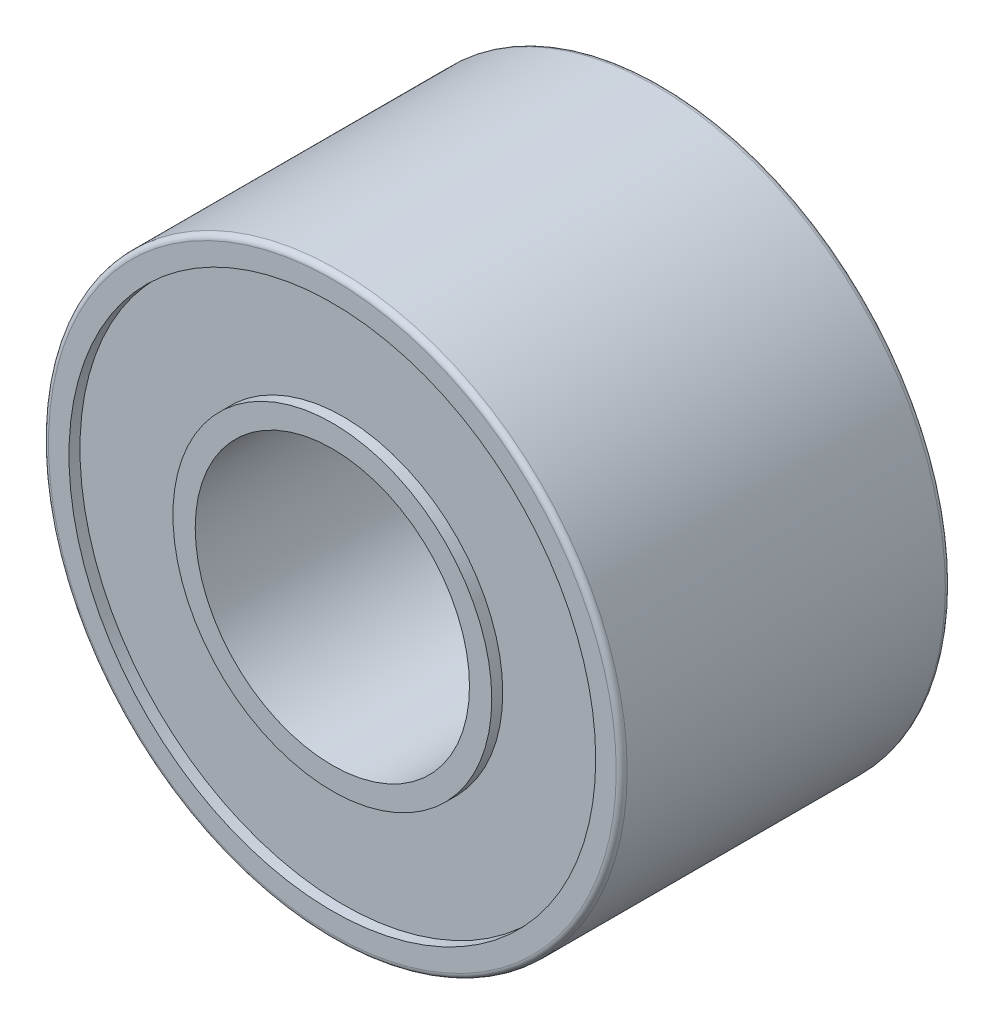
ISO-10303-21;
HEADER;
FILE_DESCRIPTION(('STEP AP214'),'2;1');
FILE_NAME('part.step','',(''),(''),'','','');
FILE_SCHEMA(('AUTOMOTIVE_DESIGN { 1 0 10303 214 1 1 1 1 }'));
ENDSEC;
DATA;
#1=APPLICATION_CONTEXT('core data for automotive mechanical design processes');
#2=APPLICATION_PROTOCOL_DEFINITION('international standard','automotive_design',2000,#1);
#3=PRODUCT_CONTEXT('',#1,'mechanical');
#4=PRODUCT('Part','Part','',(#3));
#5=PRODUCT_RELATED_PRODUCT_CATEGORY('part','',(#4));
#6=PRODUCT_DEFINITION_FORMATION('','',#4);
#7=PRODUCT_DEFINITION_CONTEXT('part definition',#1,'design');
#8=PRODUCT_DEFINITION('design','',#6,#7);
#9=PRODUCT_DEFINITION_SHAPE('','',#8);
#10=(LENGTH_UNIT() NAMED_UNIT(*) SI_UNIT(.MILLI.,.METRE.));
#11=(NAMED_UNIT(*) PLANE_ANGLE_UNIT() SI_UNIT($,.RADIAN.));
#12=(NAMED_UNIT(*) SI_UNIT($,.STERADIAN.) SOLID_ANGLE_UNIT());
#13=UNCERTAINTY_MEASURE_WITH_UNIT(LENGTH_MEASURE(1.E-05),#10,'distance_accuracy_value','');
#14=(GEOMETRIC_REPRESENTATION_CONTEXT(3) GLOBAL_UNCERTAINTY_ASSIGNED_CONTEXT((#13)) GLOBAL_UNIT_ASSIGNED_CONTEXT((#10,
#11,#12)) REPRESENTATION_CONTEXT('',''));
#15=CARTESIAN_POINT('',(0.,0.,0.));
#16=DIRECTION('',(0.,0.,1.));
#17=DIRECTION('',(1.,0.,0.));
#18=AXIS2_PLACEMENT_3D('',#15,#16,#17);
#19=CARTESIAN_POINT('',(0.,0.,-6.));
#20=DIRECTION('',(0.,0.,1.));
#21=DIRECTION('',(1.,0.,0.));
#22=AXIS2_PLACEMENT_3D('',#19,#20,#21);
#23=PLANE('',#22);
#24=CARTESIAN_POINT('',(0.,0.,-6.));
#25=DIRECTION('',(0.,0.,1.));
#26=DIRECTION('',(1.,0.,0.));
#27=AXIS2_PLACEMENT_3D('',#24,#25,#26);
#28=CIRCLE('',#27,5.);
#29=CARTESIAN_POINT('',(5.,0.,-6.));
#30=VERTEX_POINT('',#29);
#31=EDGE_CURVE('E62',#30,#30,#28,.T.);
#32=ORIENTED_EDGE('',*,*,#31,.T.);
#33=EDGE_LOOP('',(#32));
#34=FACE_BOUND('',#33,.T.);
#35=CARTESIAN_POINT('',(0.,0.,-6.));
#36=DIRECTION('',(0.,0.,1.));
#37=DIRECTION('',(1.,0.,0.));
#38=AXIS2_PLACEMENT_3D('',#35,#36,#37);
#39=CIRCLE('',#38,5.81291656527139);
#40=CARTESIAN_POINT('',(5.81291656527139,0.,-6.));
#41=VERTEX_POINT('',#40);
#42=EDGE_CURVE('E94',#41,#41,#39,.T.);
#43=ORIENTED_EDGE('',*,*,#42,.F.);
#44=EDGE_LOOP('',(#43));
#45=FACE_BOUND('',#44,.T.);
#46=ADVANCED_FACE('F37',(#34,#45),#23,.F.);
#47=CARTESIAN_POINT('',(0.,0.,6.));
#48=DIRECTION('',(0.,0.,1.));
#49=DIRECTION('',(1.,0.,0.));
#50=AXIS2_PLACEMENT_3D('',#47,#48,#49);
#51=PLANE('',#50);
#52=CARTESIAN_POINT('',(0.,0.,6.));
#53=DIRECTION('',(0.,0.,1.));
#54=DIRECTION('',(1.,0.,0.));
#55=AXIS2_PLACEMENT_3D('',#52,#53,#54);
#56=CIRCLE('',#55,5.);
#57=CARTESIAN_POINT('',(5.,0.,6.));
#58=VERTEX_POINT('',#57);
#59=EDGE_CURVE('E61',#58,#58,#56,.T.);
#60=ORIENTED_EDGE('',*,*,#59,.F.);
#61=EDGE_LOOP('',(#60));
#62=FACE_BOUND('',#61,.T.);
#63=CARTESIAN_POINT('',(0.,0.,6.));
#64=DIRECTION('',(0.,0.,1.));
#65=DIRECTION('',(1.,0.,0.));
#66=AXIS2_PLACEMENT_3D('',#63,#64,#65);
#67=CIRCLE('',#66,5.81291656527139);
#68=CARTESIAN_POINT('',(5.81291656527139,0.,6.));
#69=VERTEX_POINT('',#68);
#70=EDGE_CURVE('E78',#69,#69,#67,.T.);
#71=ORIENTED_EDGE('',*,*,#70,.T.);
#72=EDGE_LOOP('',(#71));
#73=FACE_BOUND('',#72,.T.);
#74=ADVANCED_FACE('F112',(#62,#73),#51,.T.);
#75=CARTESIAN_POINT('',(0.,0.,6.));
#76=DIRECTION('',(0.,0.,1.));
#77=DIRECTION('',(1.,0.,0.));
#78=AXIS2_PLACEMENT_3D('',#75,#76,#77);
#79=CIRCLE('',#78,9.60229601714226);
#80=CARTESIAN_POINT('',(9.60229601714226,0.,6.));
#81=VERTEX_POINT('',#80);
#82=EDGE_CURVE('E70',#81,#81,#79,.T.);
#83=ORIENTED_EDGE('',*,*,#82,.F.);
#84=EDGE_LOOP('',(#83));
#85=FACE_BOUND('',#84,.T.);
#86=CARTESIAN_POINT('',(0.,0.,6.));
#87=DIRECTION('',(0.,0.,1.));
#88=DIRECTION('',(1.,0.,0.));
#89=AXIS2_PLACEMENT_3D('',#86,#87,#88);
#90=CIRCLE('',#89,10.35);
#91=CARTESIAN_POINT('',(10.35,0.,6.));
#92=VERTEX_POINT('',#91);
#93=EDGE_CURVE('E10',#92,#92,#90,.T.);
#94=ORIENTED_EDGE('',*,*,#93,.T.);
#95=EDGE_LOOP('',(#94));
#96=FACE_BOUND('',#95,.T.);
#97=ADVANCED_FACE('F119',(#85,#96),#51,.T.);
#98=CARTESIAN_POINT('',(0.,0.,-6.));
#99=DIRECTION('',(0.,0.,1.));
#100=DIRECTION('',(1.,0.,0.));
#101=AXIS2_PLACEMENT_3D('',#98,#99,#100);
#102=CIRCLE('',#101,9.60229601714226);
#103=CARTESIAN_POINT('',(9.60229601714226,0.,-6.));
#104=VERTEX_POINT('',#103);
#105=EDGE_CURVE('E86',#104,#104,#102,.T.);
#106=ORIENTED_EDGE('',*,*,#105,.T.);
#107=EDGE_LOOP('',(#106));
#108=FACE_BOUND('',#107,.T.);
#109=CARTESIAN_POINT('',(0.,0.,-6.));
#110=DIRECTION('',(0.,0.,1.));
#111=DIRECTION('',(1.,0.,0.));
#112=AXIS2_PLACEMENT_3D('',#109,#110,#111);
#113=CIRCLE('',#112,10.35);
#114=CARTESIAN_POINT('',(10.35,0.,-6.));
#115=VERTEX_POINT('',#114);
#116=EDGE_CURVE('E45',#115,#115,#113,.F.);
#117=ORIENTED_EDGE('',*,*,#116,.T.);
#118=EDGE_LOOP('',(#117));
#119=FACE_BOUND('',#118,.T.);
#120=ADVANCED_FACE('F115',(#108,#119),#23,.F.);
#121=CARTESIAN_POINT('',(0.,0.,6.));
#122=DIRECTION('',(0.,0.,-1.));
#123=DIRECTION('',(-1.,0.,0.));
#124=AXIS2_PLACEMENT_3D('',#121,#122,#123);
#125=CYLINDRICAL_SURFACE('',#124,10.55);
#126=CARTESIAN_POINT('',(0.,0.,-5.8));
#127=DIRECTION('',(0.,0.,1.));
#128=DIRECTION('',(1.,0.,0.));
#129=AXIS2_PLACEMENT_3D('',#126,#127,#128);
#130=CIRCLE('',#129,10.55);
#131=CARTESIAN_POINT('',(10.55,0.,-5.8));
#132=VERTEX_POINT('',#131);
#133=EDGE_CURVE('E50',#132,#132,#130,.T.);
#134=ORIENTED_EDGE('',*,*,#133,.T.);
#135=EDGE_LOOP('',(#134));
#136=FACE_BOUND('',#135,.T.);
#137=CARTESIAN_POINT('',(0.,0.,5.8));
#138=DIRECTION('',(0.,0.,1.));
#139=DIRECTION('',(1.,0.,0.));
#140=AXIS2_PLACEMENT_3D('',#137,#138,#139);
#141=CIRCLE('',#140,10.55);
#142=CARTESIAN_POINT('',(10.55,0.,5.8));
#143=VERTEX_POINT('',#142);
#144=EDGE_CURVE('E55',#143,#143,#141,.F.);
#145=ORIENTED_EDGE('',*,*,#144,.T.);
#146=EDGE_LOOP('',(#145));
#147=FACE_BOUND('',#146,.T.);
#148=ADVANCED_FACE('F124',(#136,#147),#125,.T.);
#149=CARTESIAN_POINT('',(0.,0.,6.));
#150=DIRECTION('',(0.,0.,-1.));
#151=DIRECTION('',(-1.,0.,0.));
#152=AXIS2_PLACEMENT_3D('',#149,#150,#151);
#153=CYLINDRICAL_SURFACE('',#152,5.);
#154=ORIENTED_EDGE('',*,*,#59,.T.);
#155=EDGE_LOOP('',(#154));
#156=FACE_BOUND('',#155,.T.);
#157=ORIENTED_EDGE('',*,*,#31,.F.);
#158=EDGE_LOOP('',(#157));
#159=FACE_BOUND('',#158,.T.);
#160=ADVANCED_FACE('F130',(#156,#159),#153,.F.);
#161=CARTESIAN_POINT('',(0.,0.,-5.8));
#162=DIRECTION('',(0.,0.,1.));
#163=DIRECTION('',(1.,0.,0.));
#164=AXIS2_PLACEMENT_3D('',#161,#162,#163);
#165=TOROIDAL_SURFACE('',#164,10.35,0.2);
#166=ORIENTED_EDGE('',*,*,#116,.F.);
#167=EDGE_LOOP('',(#166));
#168=FACE_BOUND('',#167,.T.);
#169=ORIENTED_EDGE('',*,*,#133,.F.);
#170=EDGE_LOOP('',(#169));
#171=FACE_BOUND('',#170,.T.);
#172=ADVANCED_FACE('F157',(#168,#171),#165,.T.);
#173=CARTESIAN_POINT('',(0.,0.,5.8));
#174=DIRECTION('',(0.,0.,1.));
#175=DIRECTION('',(1.,0.,0.));
#176=AXIS2_PLACEMENT_3D('',#173,#174,#175);
#177=TOROIDAL_SURFACE('',#176,10.35,0.2);
#178=ORIENTED_EDGE('',*,*,#144,.F.);
#179=EDGE_LOOP('',(#178));
#180=FACE_BOUND('',#179,.T.);
#181=ORIENTED_EDGE('',*,*,#93,.F.);
#182=EDGE_LOOP('',(#181));
#183=FACE_BOUND('',#182,.T.);
#184=ADVANCED_FACE('F39',(#180,#183),#177,.T.);
#185=CARTESIAN_POINT('',(0.,0.,5.6));
#186=DIRECTION('',(0.,0.,1.));
#187=DIRECTION('',(1.,0.,0.));
#188=AXIS2_PLACEMENT_3D('',#185,#186,#187);
#189=CYLINDRICAL_SURFACE('',#188,9.60229601714226);
#190=CARTESIAN_POINT('',(0.,0.,5.6));
#191=DIRECTION('',(0.,0.,1.));
#192=DIRECTION('',(1.,0.,0.));
#193=AXIS2_PLACEMENT_3D('',#190,#191,#192);
#194=CIRCLE('',#193,9.60229601714226);
#195=CARTESIAN_POINT('',(9.60229601714226,0.,5.6));
#196=VERTEX_POINT('',#195);
#197=EDGE_CURVE('E66',#196,#196,#194,.T.);
#198=ORIENTED_EDGE('',*,*,#197,.F.);
#199=EDGE_LOOP('',(#198));
#200=FACE_BOUND('',#199,.T.);
#201=ORIENTED_EDGE('',*,*,#82,.T.);
#202=EDGE_LOOP('',(#201));
#203=FACE_BOUND('',#202,.T.);
#204=ADVANCED_FACE('F151',(#200,#203),#189,.F.);
#205=CARTESIAN_POINT('',(0.,0.,5.6));
#206=DIRECTION('',(0.,0.,1.));
#207=DIRECTION('',(1.,0.,0.));
#208=AXIS2_PLACEMENT_3D('',#205,#206,#207);
#209=PLANE('',#208);
#210=CARTESIAN_POINT('',(0.,0.,5.6));
#211=DIRECTION('',(0.,0.,1.));
#212=DIRECTION('',(1.,0.,0.));
#213=AXIS2_PLACEMENT_3D('',#210,#211,#212);
#214=CIRCLE('',#213,5.81291656527139);
#215=CARTESIAN_POINT('',(5.81291656527139,0.,5.6));
#216=VERTEX_POINT('',#215);
#217=EDGE_CURVE('E74',#216,#216,#214,.T.);
#218=ORIENTED_EDGE('',*,*,#217,.F.);
#219=EDGE_LOOP('',(#218));
#220=FACE_BOUND('',#219,.T.);
#221=ORIENTED_EDGE('',*,*,#197,.T.);
#222=EDGE_LOOP('',(#221));
#223=FACE_BOUND('',#222,.T.);
#224=ADVANCED_FACE('F147',(#220,#223),#209,.T.);
#225=CARTESIAN_POINT('',(0.,0.,5.6));
#226=DIRECTION('',(0.,0.,1.));
#227=DIRECTION('',(1.,0.,0.));
#228=AXIS2_PLACEMENT_3D('',#225,#226,#227);
#229=CYLINDRICAL_SURFACE('',#228,5.81291656527139);
#230=ORIENTED_EDGE('',*,*,#217,.T.);
#231=EDGE_LOOP('',(#230));
#232=FACE_BOUND('',#231,.T.);
#233=ORIENTED_EDGE('',*,*,#70,.F.);
#234=EDGE_LOOP('',(#233));
#235=FACE_BOUND('',#234,.T.);
#236=ADVANCED_FACE('F141',(#232,#235),#229,.T.);
#237=CARTESIAN_POINT('',(0.,0.,-5.6));
#238=DIRECTION('',(0.,0.,-1.));
#239=DIRECTION('',(1.,0.,0.));
#240=AXIS2_PLACEMENT_3D('',#237,#238,#239);
#241=PLANE('',#240);
#242=CARTESIAN_POINT('',(0.,0.,-5.6));
#243=DIRECTION('',(0.,0.,1.));
#244=DIRECTION('',(1.,0.,0.));
#245=AXIS2_PLACEMENT_3D('',#242,#243,#244);
#246=CIRCLE('',#245,9.60229601714226);
#247=CARTESIAN_POINT('',(9.60229601714226,0.,-5.6));
#248=VERTEX_POINT('',#247);
#249=EDGE_CURVE('E82',#248,#248,#246,.T.);
#250=ORIENTED_EDGE('',*,*,#249,.F.);
#251=EDGE_LOOP('',(#250));
#252=FACE_BOUND('',#251,.T.);
#253=CARTESIAN_POINT('',(0.,0.,-5.6));
#254=DIRECTION('',(0.,0.,1.));
#255=DIRECTION('',(1.,0.,0.));
#256=AXIS2_PLACEMENT_3D('',#253,#254,#255);
#257=CIRCLE('',#256,5.81291656527139);
#258=CARTESIAN_POINT('',(5.81291656527139,0.,-5.6));
#259=VERTEX_POINT('',#258);
#260=EDGE_CURVE('E90',#259,#259,#257,.T.);
#261=ORIENTED_EDGE('',*,*,#260,.T.);
#262=EDGE_LOOP('',(#261));
#263=FACE_BOUND('',#262,.T.);
#264=ADVANCED_FACE('F102',(#252,#263),#241,.T.);
#265=CARTESIAN_POINT('',(0.,0.,-5.6));
#266=DIRECTION('',(0.,0.,-1.));
#267=DIRECTION('',(-1.,0.,0.));
#268=AXIS2_PLACEMENT_3D('',#265,#266,#267);
#269=CYLINDRICAL_SURFACE('',#268,9.60229601714226);
#270=ORIENTED_EDGE('',*,*,#249,.T.);
#271=EDGE_LOOP('',(#270));
#272=FACE_BOUND('',#271,.T.);
#273=ORIENTED_EDGE('',*,*,#105,.F.);
#274=EDGE_LOOP('',(#273));
#275=FACE_BOUND('',#274,.T.);
#276=ADVANCED_FACE('F107',(#272,#275),#269,.F.);
#277=CARTESIAN_POINT('',(0.,0.,-5.6));
#278=DIRECTION('',(0.,0.,-1.));
#279=DIRECTION('',(-1.,0.,0.));
#280=AXIS2_PLACEMENT_3D('',#277,#278,#279);
#281=CYLINDRICAL_SURFACE('',#280,5.81291656527139);
#282=ORIENTED_EDGE('',*,*,#260,.F.);
#283=EDGE_LOOP('',(#282));
#284=FACE_BOUND('',#283,.T.);
#285=ORIENTED_EDGE('',*,*,#42,.T.);
#286=EDGE_LOOP('',(#285));
#287=FACE_BOUND('',#286,.T.);
#288=ADVANCED_FACE('F104',(#284,#287),#281,.T.);
#289=CLOSED_SHELL('',(#46,#74,#97,#120,#148,#160,#172,#184,#204,#224,#236,#264,#276,#288));
#290=MANIFOLD_SOLID_BREP('B2',#289);
#291=ADVANCED_BREP_SHAPE_REPRESENTATION('',(#18,#290),#14);
#292=SHAPE_DEFINITION_REPRESENTATION(#9,#291);
ENDSEC;
END-ISO-10303-21;
